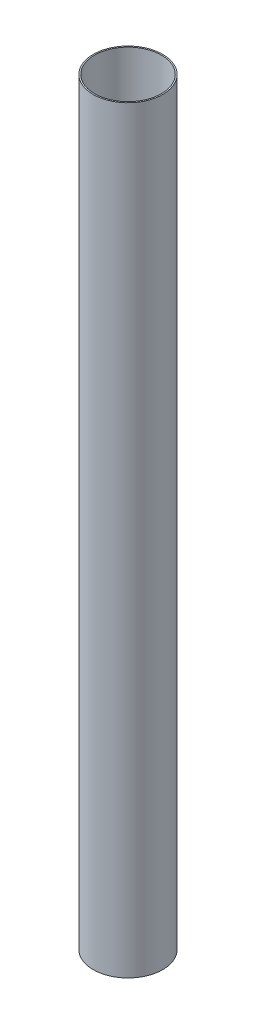
ISO-10303-21;
HEADER;
FILE_DESCRIPTION(('STEP AP214'),'2;1');
FILE_NAME('part.step','',(''),(''),'','','');
FILE_SCHEMA(('AUTOMOTIVE_DESIGN { 1 0 10303 214 1 1 1 1 }'));
ENDSEC;
DATA;
#1=APPLICATION_CONTEXT('core data for automotive mechanical design processes');
#2=APPLICATION_PROTOCOL_DEFINITION('international standard','automotive_design',2000,#1);
#3=PRODUCT_CONTEXT('',#1,'mechanical');
#4=PRODUCT('Part','Part','',(#3));
#5=PRODUCT_RELATED_PRODUCT_CATEGORY('part','',(#4));
#6=PRODUCT_DEFINITION_FORMATION('','',#4);
#7=PRODUCT_DEFINITION_CONTEXT('part definition',#1,'design');
#8=PRODUCT_DEFINITION('design','',#6,#7);
#9=PRODUCT_DEFINITION_SHAPE('','',#8);
#10=(LENGTH_UNIT() NAMED_UNIT(*) SI_UNIT(.MILLI.,.METRE.));
#11=(NAMED_UNIT(*) PLANE_ANGLE_UNIT() SI_UNIT($,.RADIAN.));
#12=(NAMED_UNIT(*) SI_UNIT($,.STERADIAN.) SOLID_ANGLE_UNIT());
#13=UNCERTAINTY_MEASURE_WITH_UNIT(LENGTH_MEASURE(1.E-05),#10,'distance_accuracy_value','');
#14=(GEOMETRIC_REPRESENTATION_CONTEXT(3) GLOBAL_UNCERTAINTY_ASSIGNED_CONTEXT((#13)) GLOBAL_UNIT_ASSIGNED_CONTEXT((#10,
#11,#12)) REPRESENTATION_CONTEXT('',''));
#15=CARTESIAN_POINT('',(0.,0.,0.));
#16=DIRECTION('',(0.,0.,1.));
#17=DIRECTION('',(1.,0.,0.));
#18=AXIS2_PLACEMENT_3D('',#15,#16,#17);
#19=CARTESIAN_POINT('',(0.,863.6,0.));
#20=DIRECTION('',(0.,1.,0.));
#21=DIRECTION('',(0.,0.,1.));
#22=AXIS2_PLACEMENT_3D('',#19,#20,#21);
#23=PLANE('',#22);
#24=CARTESIAN_POINT('',(0.,863.6,0.));
#25=DIRECTION('',(0.,1.,0.));
#26=DIRECTION('',(0.,0.,1.));
#27=AXIS2_PLACEMENT_3D('',#24,#25,#26);
#28=CIRCLE('',#27,39.624);
#29=CARTESIAN_POINT('',(0.,863.6,39.624));
#30=VERTEX_POINT('',#29);
#31=EDGE_CURVE('E10',#30,#30,#28,.T.);
#32=ORIENTED_EDGE('',*,*,#31,.T.);
#33=EDGE_LOOP('',(#32));
#34=FACE_BOUND('',#33,.T.);
#35=CARTESIAN_POINT('',(0.,863.6,0.));
#36=DIRECTION('',(0.,1.,0.));
#37=DIRECTION('',(0.,0.,1.));
#38=AXIS2_PLACEMENT_3D('',#35,#36,#37);
#39=CIRCLE('',#38,38.1);
#40=CARTESIAN_POINT('',(0.,863.6,38.1));
#41=VERTEX_POINT('',#40);
#42=EDGE_CURVE('E58',#41,#41,#39,.T.);
#43=ORIENTED_EDGE('',*,*,#42,.F.);
#44=EDGE_LOOP('',(#43));
#45=FACE_BOUND('',#44,.T.);
#46=ADVANCED_FACE('F45',(#34,#45),#23,.T.);
#47=CARTESIAN_POINT('',(0.,0.,0.));
#48=DIRECTION('',(0.,1.,0.));
#49=DIRECTION('',(0.,0.,1.));
#50=AXIS2_PLACEMENT_3D('',#47,#48,#49);
#51=PLANE('',#50);
#52=CARTESIAN_POINT('',(0.,0.,0.));
#53=DIRECTION('',(0.,1.,0.));
#54=DIRECTION('',(0.,0.,1.));
#55=AXIS2_PLACEMENT_3D('',#52,#53,#54);
#56=CIRCLE('',#55,39.624);
#57=CARTESIAN_POINT('',(0.,0.,39.624));
#58=VERTEX_POINT('',#57);
#59=EDGE_CURVE('E49',#58,#58,#56,.T.);
#60=ORIENTED_EDGE('',*,*,#59,.F.);
#61=EDGE_LOOP('',(#60));
#62=FACE_BOUND('',#61,.T.);
#63=CARTESIAN_POINT('',(0.,0.,0.));
#64=DIRECTION('',(0.,1.,0.));
#65=DIRECTION('',(0.,0.,1.));
#66=AXIS2_PLACEMENT_3D('',#63,#64,#65);
#67=CIRCLE('',#66,38.1);
#68=CARTESIAN_POINT('',(0.,0.,38.1));
#69=VERTEX_POINT('',#68);
#70=EDGE_CURVE('E60',#69,#69,#67,.T.);
#71=ORIENTED_EDGE('',*,*,#70,.T.);
#72=EDGE_LOOP('',(#71));
#73=FACE_BOUND('',#72,.T.);
#74=ADVANCED_FACE('F72',(#62,#73),#51,.F.);
#75=CARTESIAN_POINT('',(0.,863.6,0.));
#76=DIRECTION('',(0.,-1.,0.));
#77=DIRECTION('',(0.,0.,-1.));
#78=AXIS2_PLACEMENT_3D('',#75,#76,#77);
#79=CYLINDRICAL_SURFACE('',#78,39.624);
#80=ORIENTED_EDGE('',*,*,#31,.F.);
#81=EDGE_LOOP('',(#80));
#82=FACE_BOUND('',#81,.T.);
#83=ORIENTED_EDGE('',*,*,#59,.T.);
#84=EDGE_LOOP('',(#83));
#85=FACE_BOUND('',#84,.T.);
#86=ADVANCED_FACE('F47',(#82,#85),#79,.T.);
#87=CARTESIAN_POINT('',(0.,863.6,0.));
#88=DIRECTION('',(0.,-1.,0.));
#89=DIRECTION('',(0.,0.,-1.));
#90=AXIS2_PLACEMENT_3D('',#87,#88,#89);
#91=CYLINDRICAL_SURFACE('',#90,38.1);
#92=ORIENTED_EDGE('',*,*,#42,.T.);
#93=EDGE_LOOP('',(#92));
#94=FACE_BOUND('',#93,.T.);
#95=ORIENTED_EDGE('',*,*,#70,.F.);
#96=EDGE_LOOP('',(#95));
#97=FACE_BOUND('',#96,.T.);
#98=ADVANCED_FACE('F68',(#94,#97),#91,.F.);
#99=CLOSED_SHELL('',(#46,#74,#86,#98));
#100=MANIFOLD_SOLID_BREP('B2',#99);
#101=ADVANCED_BREP_SHAPE_REPRESENTATION('',(#18,#100),#14);
#102=SHAPE_DEFINITION_REPRESENTATION(#9,#101);
ENDSEC;
END-ISO-10303-21;
